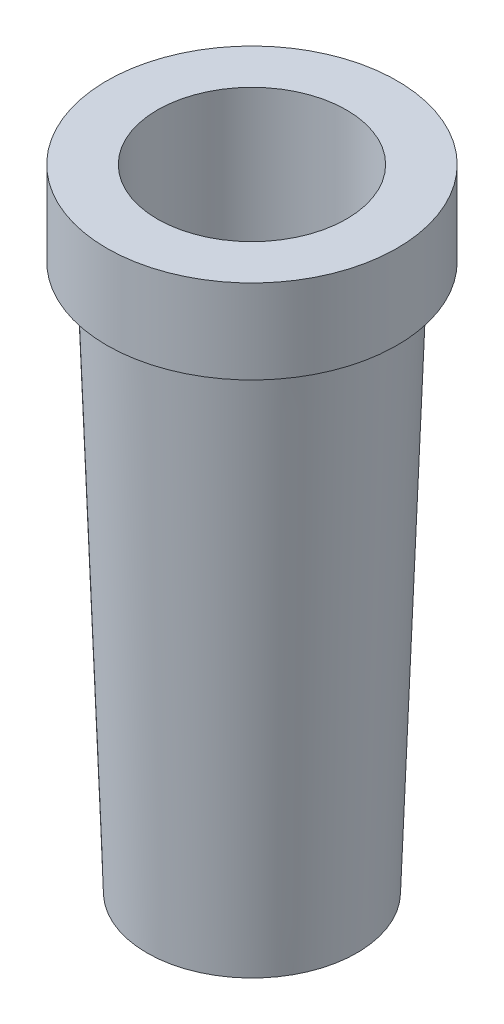
ISO-10303-21;
HEADER;
FILE_DESCRIPTION(('STEP AP214'),'2;1');
FILE_NAME('part.step','',(''),(''),'','','');
FILE_SCHEMA(('AUTOMOTIVE_DESIGN { 1 0 10303 214 1 1 1 1 }'));
ENDSEC;
DATA;
#1=APPLICATION_CONTEXT('core data for automotive mechanical design processes');
#2=APPLICATION_PROTOCOL_DEFINITION('international standard','automotive_design',2000,#1);
#3=PRODUCT_CONTEXT('',#1,'mechanical');
#4=PRODUCT('Part','Part','',(#3));
#5=PRODUCT_RELATED_PRODUCT_CATEGORY('part','',(#4));
#6=PRODUCT_DEFINITION_FORMATION('','',#4);
#7=PRODUCT_DEFINITION_CONTEXT('part definition',#1,'design');
#8=PRODUCT_DEFINITION('design','',#6,#7);
#9=PRODUCT_DEFINITION_SHAPE('','',#8);
#10=(LENGTH_UNIT() NAMED_UNIT(*) SI_UNIT(.MILLI.,.METRE.));
#11=(NAMED_UNIT(*) PLANE_ANGLE_UNIT() SI_UNIT($,.RADIAN.));
#12=(NAMED_UNIT(*) SI_UNIT($,.STERADIAN.) SOLID_ANGLE_UNIT());
#13=UNCERTAINTY_MEASURE_WITH_UNIT(LENGTH_MEASURE(1.E-05),#10,'distance_accuracy_value','');
#14=(GEOMETRIC_REPRESENTATION_CONTEXT(3) GLOBAL_UNCERTAINTY_ASSIGNED_CONTEXT((#13)) GLOBAL_UNIT_ASSIGNED_CONTEXT((#10,
#11,#12)) REPRESENTATION_CONTEXT('',''));
#15=CARTESIAN_POINT('',(0.,0.,0.));
#16=DIRECTION('',(0.,0.,1.));
#17=DIRECTION('',(1.,0.,0.));
#18=AXIS2_PLACEMENT_3D('',#15,#16,#17);
#19=CARTESIAN_POINT('',(0.,0.,0.));
#20=DIRECTION('',(0.,1.,0.));
#21=DIRECTION('',(0.,0.,1.));
#22=AXIS2_PLACEMENT_3D('',#19,#20,#21);
#23=PLANE('',#22);
#24=CARTESIAN_POINT('',(0.,0.,0.));
#25=DIRECTION('',(0.,1.,0.));
#26=DIRECTION('',(0.,0.,1.));
#27=AXIS2_PLACEMENT_3D('',#24,#25,#26);
#28=CIRCLE('',#27,2.25);
#29=CARTESIAN_POINT('',(0.,0.,2.25));
#30=VERTEX_POINT('',#29);
#31=EDGE_CURVE('E58',#30,#30,#28,.T.);
#32=ORIENTED_EDGE('',*,*,#31,.T.);
#33=EDGE_LOOP('',(#32));
#34=FACE_BOUND('',#33,.T.);
#35=CARTESIAN_POINT('',(0.,0.,0.));
#36=DIRECTION('',(0.,1.,0.));
#37=DIRECTION('',(0.,0.,1.));
#38=AXIS2_PLACEMENT_3D('',#35,#36,#37);
#39=CIRCLE('',#38,2.5);
#40=CARTESIAN_POINT('',(0.,0.,2.5));
#41=VERTEX_POINT('',#40);
#42=EDGE_CURVE('E10',#41,#41,#39,.T.);
#43=ORIENTED_EDGE('',*,*,#42,.F.);
#44=EDGE_LOOP('',(#43));
#45=FACE_BOUND('',#44,.T.);
#46=ADVANCED_FACE('F39',(#34,#45),#23,.F.);
#47=CARTESIAN_POINT('',(0.,0.,0.));
#48=DIRECTION('',(0.,1.,0.));
#49=DIRECTION('',(0.,0.,1.));
#50=AXIS2_PLACEMENT_3D('',#47,#48,#49);
#51=CONICAL_SURFACE('',#50,2.5,0.0349065850398825);
#52=CARTESIAN_POINT('',(0.,13.,0.));
#53=DIRECTION('',(0.,1.,0.));
#54=DIRECTION('',(0.,0.,1.));
#55=AXIS2_PLACEMENT_3D('',#52,#53,#54);
#56=CIRCLE('',#55,2.95397000339267);
#57=CARTESIAN_POINT('',(0.,13.,2.95397000339267));
#58=VERTEX_POINT('',#57);
#59=EDGE_CURVE('E45',#58,#58,#56,.T.);
#60=ORIENTED_EDGE('',*,*,#59,.F.);
#61=EDGE_LOOP('',(#60));
#62=FACE_BOUND('',#61,.T.);
#63=ORIENTED_EDGE('',*,*,#42,.T.);
#64=EDGE_LOOP('',(#63));
#65=FACE_BOUND('',#64,.T.);
#66=ADVANCED_FACE('F81',(#62,#65),#51,.T.);
#67=CARTESIAN_POINT('',(2.95397000339267,13.,0.));
#68=DIRECTION('',(0.,1.,0.));
#69=DIRECTION('',(0.,0.,1.));
#70=AXIS2_PLACEMENT_3D('',#67,#68,#69);
#71=PLANE('',#70);
#72=CARTESIAN_POINT('',(0.,13.,0.));
#73=DIRECTION('',(0.,1.,0.));
#74=DIRECTION('',(0.,0.,1.));
#75=AXIS2_PLACEMENT_3D('',#72,#73,#74);
#76=CIRCLE('',#75,3.45397000339267);
#77=CARTESIAN_POINT('',(0.,13.,3.45397000339267));
#78=VERTEX_POINT('',#77);
#79=EDGE_CURVE('E49',#78,#78,#76,.T.);
#80=ORIENTED_EDGE('',*,*,#79,.F.);
#81=EDGE_LOOP('',(#80));
#82=FACE_BOUND('',#81,.T.);
#83=ORIENTED_EDGE('',*,*,#59,.T.);
#84=EDGE_LOOP('',(#83));
#85=FACE_BOUND('',#84,.T.);
#86=ADVANCED_FACE('F76',(#82,#85),#71,.F.);
#87=CARTESIAN_POINT('',(0.,15.,0.));
#88=DIRECTION('',(0.,1.,0.));
#89=DIRECTION('',(0.,0.,1.));
#90=AXIS2_PLACEMENT_3D('',#87,#88,#89);
#91=CYLINDRICAL_SURFACE('',#90,3.45397000339267);
#92=CARTESIAN_POINT('',(0.,15.,0.));
#93=DIRECTION('',(0.,1.,0.));
#94=DIRECTION('',(0.,0.,1.));
#95=AXIS2_PLACEMENT_3D('',#92,#93,#94);
#96=CIRCLE('',#95,3.45397000339267);
#97=CARTESIAN_POINT('',(0.,15.,3.45397000339267));
#98=VERTEX_POINT('',#97);
#99=EDGE_CURVE('E53',#98,#98,#96,.T.);
#100=ORIENTED_EDGE('',*,*,#99,.F.);
#101=EDGE_LOOP('',(#100));
#102=FACE_BOUND('',#101,.T.);
#103=ORIENTED_EDGE('',*,*,#79,.T.);
#104=EDGE_LOOP('',(#103));
#105=FACE_BOUND('',#104,.T.);
#106=ADVANCED_FACE('F70',(#102,#105),#91,.T.);
#107=CARTESIAN_POINT('',(3.45397000339267,15.,0.));
#108=DIRECTION('',(0.,-1.,0.));
#109=DIRECTION('',(0.,0.,-1.));
#110=AXIS2_PLACEMENT_3D('',#107,#108,#109);
#111=PLANE('',#110);
#112=CARTESIAN_POINT('',(0.,15.,0.));
#113=DIRECTION('',(0.,1.,0.));
#114=DIRECTION('',(0.,0.,1.));
#115=AXIS2_PLACEMENT_3D('',#112,#113,#114);
#116=CIRCLE('',#115,2.25);
#117=CARTESIAN_POINT('',(0.,15.,2.25));
#118=VERTEX_POINT('',#117);
#119=EDGE_CURVE('E61',#118,#118,#116,.T.);
#120=ORIENTED_EDGE('',*,*,#119,.F.);
#121=EDGE_LOOP('',(#120));
#122=FACE_BOUND('',#121,.T.);
#123=ORIENTED_EDGE('',*,*,#99,.T.);
#124=EDGE_LOOP('',(#123));
#125=FACE_BOUND('',#124,.T.);
#126=ADVANCED_FACE('F67',(#122,#125),#111,.F.);
#127=CARTESIAN_POINT('',(0.,15.,0.));
#128=DIRECTION('',(0.,1.,0.));
#129=DIRECTION('',(0.,0.,1.));
#130=AXIS2_PLACEMENT_3D('',#127,#128,#129);
#131=CYLINDRICAL_SURFACE('',#130,2.25);
#132=ORIENTED_EDGE('',*,*,#31,.F.);
#133=EDGE_LOOP('',(#132));
#134=FACE_BOUND('',#133,.T.);
#135=ORIENTED_EDGE('',*,*,#119,.T.);
#136=EDGE_LOOP('',(#135));
#137=FACE_BOUND('',#136,.T.);
#138=ADVANCED_FACE('F65',(#134,#137),#131,.F.);
#139=CLOSED_SHELL('',(#46,#66,#86,#106,#126,#138));
#140=MANIFOLD_SOLID_BREP('B2',#139);
#141=ADVANCED_BREP_SHAPE_REPRESENTATION('',(#18,#140),#14);
#142=SHAPE_DEFINITION_REPRESENTATION(#9,#141);
ENDSEC;
END-ISO-10303-21;
